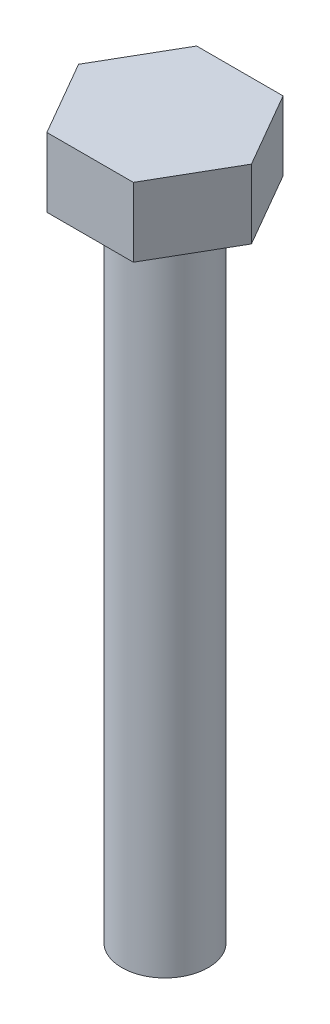
ISO-10303-21;
HEADER;
FILE_DESCRIPTION(('STEP AP214'),'2;1');
FILE_NAME('part.step','',(''),(''),'','','');
FILE_SCHEMA(('AUTOMOTIVE_DESIGN { 1 0 10303 214 1 1 1 1 }'));
ENDSEC;
DATA;
#1=APPLICATION_CONTEXT('core data for automotive mechanical design processes');
#2=APPLICATION_PROTOCOL_DEFINITION('international standard','automotive_design',2000,#1);
#3=PRODUCT_CONTEXT('',#1,'mechanical');
#4=PRODUCT('Part','Part','',(#3));
#5=PRODUCT_RELATED_PRODUCT_CATEGORY('part','',(#4));
#6=PRODUCT_DEFINITION_FORMATION('','',#4);
#7=PRODUCT_DEFINITION_CONTEXT('part definition',#1,'design');
#8=PRODUCT_DEFINITION('design','',#6,#7);
#9=PRODUCT_DEFINITION_SHAPE('','',#8);
#10=(LENGTH_UNIT() NAMED_UNIT(*) SI_UNIT(.MILLI.,.METRE.));
#11=(NAMED_UNIT(*) PLANE_ANGLE_UNIT() SI_UNIT($,.RADIAN.));
#12=(NAMED_UNIT(*) SI_UNIT($,.STERADIAN.) SOLID_ANGLE_UNIT());
#13=UNCERTAINTY_MEASURE_WITH_UNIT(LENGTH_MEASURE(1.E-05),#10,'distance_accuracy_value','');
#14=(GEOMETRIC_REPRESENTATION_CONTEXT(3) GLOBAL_UNCERTAINTY_ASSIGNED_CONTEXT((#13)) GLOBAL_UNIT_ASSIGNED_CONTEXT((#10,
#11,#12)) REPRESENTATION_CONTEXT('',''));
#15=CARTESIAN_POINT('',(0.,0.,0.));
#16=DIRECTION('',(0.,0.,1.));
#17=DIRECTION('',(1.,0.,0.));
#18=AXIS2_PLACEMENT_3D('',#15,#16,#17);
#19=CARTESIAN_POINT('',(0.,75.,0.));
#20=DIRECTION('',(0.,-1.,0.));
#21=DIRECTION('',(0.,0.,-1.));
#22=AXIS2_PLACEMENT_3D('',#19,#20,#21);
#23=CYLINDRICAL_SURFACE('',#22,5.);
#24=CARTESIAN_POINT('',(0.,75.,0.));
#25=DIRECTION('',(0.,1.,0.));
#26=DIRECTION('',(0.,0.,1.));
#27=AXIS2_PLACEMENT_3D('',#24,#25,#26);
#28=CIRCLE('',#27,5.);
#29=CARTESIAN_POINT('',(0.,75.,5.));
#30=VERTEX_POINT('',#29);
#31=EDGE_CURVE('E11',#30,#30,#28,.T.);
#32=ORIENTED_EDGE('',*,*,#31,.F.);
#33=EDGE_LOOP('',(#32));
#34=FACE_BOUND('',#33,.T.);
#35=CARTESIAN_POINT('',(0.,0.,0.));
#36=DIRECTION('',(0.,1.,0.));
#37=DIRECTION('',(0.,0.,1.));
#38=AXIS2_PLACEMENT_3D('',#35,#36,#37);
#39=CIRCLE('',#38,5.);
#40=CARTESIAN_POINT('',(0.,0.,5.));
#41=VERTEX_POINT('',#40);
#42=EDGE_CURVE('E35',#41,#41,#39,.T.);
#43=ORIENTED_EDGE('',*,*,#42,.T.);
#44=EDGE_LOOP('',(#43));
#45=FACE_BOUND('',#44,.T.);
#46=ADVANCED_FACE('F32',(#34,#45),#23,.T.);
#47=CARTESIAN_POINT('',(0.,0.,0.));
#48=DIRECTION('',(0.,1.,0.));
#49=DIRECTION('',(0.,0.,1.));
#50=AXIS2_PLACEMENT_3D('',#47,#48,#49);
#51=PLANE('',#50);
#52=ORIENTED_EDGE('',*,*,#42,.F.);
#53=EDGE_LOOP('',(#52));
#54=FACE_BOUND('',#53,.T.);
#55=ADVANCED_FACE('F140',(#54),#51,.F.);
#56=CARTESIAN_POINT('',(-9.99999999999998,83.,0.));
#57=DIRECTION('',(0.86602540378444,0.,0.499999999999998));
#58=DIRECTION('',(0.499999999999998,0.,-0.86602540378444));
#59=AXIS2_PLACEMENT_3D('',#56,#57,#58);
#60=PLANE('',#59);
#61=DIRECTION('',(-0.499999999999998,0.,0.86602540378444));
#62=VECTOR('',#61,1.);
#63=CARTESIAN_POINT('',(-9.99999999999998,75.,0.));
#64=LINE('',#63,#62);
#65=CARTESIAN_POINT('',(-5.,75.,-8.66025403784436));
#66=VERTEX_POINT('',#65);
#67=CARTESIAN_POINT('',(-9.99999999999998,75.,0.));
#68=VERTEX_POINT('',#67);
#69=EDGE_CURVE('E117',#66,#68,#64,.T.);
#70=ORIENTED_EDGE('',*,*,#69,.T.);
#71=DIRECTION('',(0.,-1.,0.));
#72=VECTOR('',#71,1.);
#73=CARTESIAN_POINT('',(-9.99999999999998,83.,0.));
#74=LINE('',#73,#72);
#75=CARTESIAN_POINT('',(-9.99999999999998,83.,0.));
#76=VERTEX_POINT('',#75);
#77=EDGE_CURVE('E134',#76,#68,#74,.T.);
#78=ORIENTED_EDGE('',*,*,#77,.F.);
#79=DIRECTION('',(-0.499999999999998,0.,0.86602540378444));
#80=VECTOR('',#79,1.);
#81=CARTESIAN_POINT('',(-9.99999999999998,83.,0.));
#82=LINE('',#81,#80);
#83=CARTESIAN_POINT('',(-5.,83.,-8.66025403784436));
#84=VERTEX_POINT('',#83);
#85=EDGE_CURVE('E127',#84,#76,#82,.T.);
#86=ORIENTED_EDGE('',*,*,#85,.F.);
#87=DIRECTION('',(0.,-1.,0.));
#88=VECTOR('',#87,1.);
#89=CARTESIAN_POINT('',(-5.,83.,-8.66025403784436));
#90=LINE('',#89,#88);
#91=EDGE_CURVE('E113',#84,#66,#90,.T.);
#92=ORIENTED_EDGE('',*,*,#91,.T.);
#93=EDGE_LOOP('',(#70,#78,#86,#92));
#94=FACE_BOUND('',#93,.T.);
#95=ADVANCED_FACE('F142',(#94),#60,.F.);
#96=CARTESIAN_POINT('',(-4.99999999999996,83.,8.66025403784441));
#97=DIRECTION('',(0.866025403784437,0.,-0.500000000000002));
#98=DIRECTION('',(-0.500000000000002,0.,-0.866025403784437));
#99=AXIS2_PLACEMENT_3D('',#96,#97,#98);
#100=PLANE('',#99);
#101=DIRECTION('',(0.500000000000002,0.,0.866025403784437));
#102=VECTOR('',#101,1.);
#103=CARTESIAN_POINT('',(-4.99999999999996,75.,8.66025403784441));
#104=LINE('',#103,#102);
#105=CARTESIAN_POINT('',(-4.99999999999996,75.,8.66025403784441));
#106=VERTEX_POINT('',#105);
#107=EDGE_CURVE('E120',#68,#106,#104,.T.);
#108=ORIENTED_EDGE('',*,*,#107,.T.);
#109=DIRECTION('',(0.,-1.,0.));
#110=VECTOR('',#109,1.);
#111=CARTESIAN_POINT('',(-4.99999999999996,83.,8.66025403784441));
#112=LINE('',#111,#110);
#113=CARTESIAN_POINT('',(-4.99999999999996,83.,8.66025403784441));
#114=VERTEX_POINT('',#113);
#115=EDGE_CURVE('E131',#114,#106,#112,.T.);
#116=ORIENTED_EDGE('',*,*,#115,.F.);
#117=DIRECTION('',(0.500000000000002,0.,0.866025403784437));
#118=VECTOR('',#117,1.);
#119=CARTESIAN_POINT('',(-4.99999999999996,83.,8.66025403784441));
#120=LINE('',#119,#118);
#121=EDGE_CURVE('E86',#76,#114,#120,.T.);
#122=ORIENTED_EDGE('',*,*,#121,.F.);
#123=ORIENTED_EDGE('',*,*,#77,.T.);
#124=EDGE_LOOP('',(#108,#116,#122,#123));
#125=FACE_BOUND('',#124,.T.);
#126=ADVANCED_FACE('F147',(#125),#100,.F.);
#127=CARTESIAN_POINT('',(5.00000000000004,83.,8.66025403784443));
#128=DIRECTION('',(0.,0.,-1.));
#129=DIRECTION('',(-1.,0.,0.));
#130=AXIS2_PLACEMENT_3D('',#127,#128,#129);
#131=PLANE('',#130);
#132=DIRECTION('',(1.,0.,0.));
#133=VECTOR('',#132,1.);
#134=CARTESIAN_POINT('',(5.00000000000004,75.,8.66025403784443));
#135=LINE('',#134,#133);
#136=CARTESIAN_POINT('',(5.00000000000004,75.,8.66025403784443));
#137=VERTEX_POINT('',#136);
#138=EDGE_CURVE('E122',#106,#137,#135,.T.);
#139=ORIENTED_EDGE('',*,*,#138,.T.);
#140=DIRECTION('',(0.,-1.,0.));
#141=VECTOR('',#140,1.);
#142=CARTESIAN_POINT('',(5.00000000000004,83.,8.66025403784443));
#143=LINE('',#142,#141);
#144=CARTESIAN_POINT('',(5.00000000000004,83.,8.66025403784443));
#145=VERTEX_POINT('',#144);
#146=EDGE_CURVE('E108',#145,#137,#143,.T.);
#147=ORIENTED_EDGE('',*,*,#146,.F.);
#148=DIRECTION('',(1.,0.,0.));
#149=VECTOR('',#148,1.);
#150=CARTESIAN_POINT('',(5.00000000000004,83.,8.66025403784443));
#151=LINE('',#150,#149);
#152=EDGE_CURVE('E99',#114,#145,#151,.T.);
#153=ORIENTED_EDGE('',*,*,#152,.F.);
#154=ORIENTED_EDGE('',*,*,#115,.T.);
#155=EDGE_LOOP('',(#139,#147,#153,#154));
#156=FACE_BOUND('',#155,.T.);
#157=ADVANCED_FACE('F154',(#156),#131,.F.);
#158=CARTESIAN_POINT('',(10.,83.,0.));
#159=DIRECTION('',(-0.866025403784439,0.,-0.5));
#160=DIRECTION('',(-0.5,0.,0.866025403784439));
#161=AXIS2_PLACEMENT_3D('',#158,#159,#160);
#162=PLANE('',#161);
#163=DIRECTION('',(0.5,0.,-0.866025403784439));
#164=VECTOR('',#163,1.);
#165=CARTESIAN_POINT('',(10.,75.,0.));
#166=LINE('',#165,#164);
#167=CARTESIAN_POINT('',(10.,75.,0.));
#168=VERTEX_POINT('',#167);
#169=EDGE_CURVE('E107',#137,#168,#166,.T.);
#170=ORIENTED_EDGE('',*,*,#169,.T.);
#171=DIRECTION('',(0.,-1.,0.));
#172=VECTOR('',#171,1.);
#173=CARTESIAN_POINT('',(10.,83.,0.));
#174=LINE('',#173,#172);
#175=CARTESIAN_POINT('',(10.,83.,0.));
#176=VERTEX_POINT('',#175);
#177=EDGE_CURVE('E104',#176,#168,#174,.T.);
#178=ORIENTED_EDGE('',*,*,#177,.F.);
#179=DIRECTION('',(0.5,0.,-0.866025403784439));
#180=VECTOR('',#179,1.);
#181=CARTESIAN_POINT('',(10.,83.,0.));
#182=LINE('',#181,#180);
#183=EDGE_CURVE('E93',#145,#176,#182,.T.);
#184=ORIENTED_EDGE('',*,*,#183,.F.);
#185=ORIENTED_EDGE('',*,*,#146,.T.);
#186=EDGE_LOOP('',(#170,#178,#184,#185));
#187=FACE_BOUND('',#186,.T.);
#188=ADVANCED_FACE('F105',(#187),#162,.F.);
#189=CARTESIAN_POINT('',(5.,83.,-8.66025403784436));
#190=DIRECTION('',(-0.866025403784437,0.,0.500000000000003));
#191=DIRECTION('',(0.500000000000002,0.,0.866025403784437));
#192=AXIS2_PLACEMENT_3D('',#189,#190,#191);
#193=PLANE('',#192);
#194=DIRECTION('',(-0.500000000000002,0.,-0.866025403784437));
#195=VECTOR('',#194,1.);
#196=CARTESIAN_POINT('',(5.,75.,-8.66025403784436));
#197=LINE('',#196,#195);
#198=CARTESIAN_POINT('',(5.,75.,-8.66025403784436));
#199=VERTEX_POINT('',#198);
#200=EDGE_CURVE('E71',#168,#199,#197,.T.);
#201=ORIENTED_EDGE('',*,*,#200,.T.);
#202=DIRECTION('',(0.,-1.,0.));
#203=VECTOR('',#202,1.);
#204=CARTESIAN_POINT('',(5.,83.,-8.66025403784436));
#205=LINE('',#204,#203);
#206=CARTESIAN_POINT('',(5.,83.,-8.66025403784436));
#207=VERTEX_POINT('',#206);
#208=EDGE_CURVE('E109',#207,#199,#205,.T.);
#209=ORIENTED_EDGE('',*,*,#208,.F.);
#210=DIRECTION('',(-0.500000000000002,0.,-0.866025403784437));
#211=VECTOR('',#210,1.);
#212=CARTESIAN_POINT('',(5.,83.,-8.66025403784436));
#213=LINE('',#212,#211);
#214=EDGE_CURVE('E97',#176,#207,#213,.T.);
#215=ORIENTED_EDGE('',*,*,#214,.F.);
#216=ORIENTED_EDGE('',*,*,#177,.T.);
#217=EDGE_LOOP('',(#201,#209,#215,#216));
#218=FACE_BOUND('',#217,.T.);
#219=ADVANCED_FACE('F111',(#218),#193,.F.);
#220=CARTESIAN_POINT('',(-5.,83.,-8.66025403784436));
#221=DIRECTION('',(0.,0.,1.));
#222=DIRECTION('',(1.,0.,0.));
#223=AXIS2_PLACEMENT_3D('',#220,#221,#222);
#224=PLANE('',#223);
#225=DIRECTION('',(-1.,0.,0.));
#226=VECTOR('',#225,1.);
#227=CARTESIAN_POINT('',(-5.,75.,-8.66025403784436));
#228=LINE('',#227,#226);
#229=EDGE_CURVE('E77',#199,#66,#228,.T.);
#230=ORIENTED_EDGE('',*,*,#229,.T.);
#231=ORIENTED_EDGE('',*,*,#91,.F.);
#232=DIRECTION('',(-1.,0.,0.));
#233=VECTOR('',#232,1.);
#234=CARTESIAN_POINT('',(-5.,83.,-8.66025403784436));
#235=LINE('',#234,#233);
#236=EDGE_CURVE('E48',#207,#84,#235,.T.);
#237=ORIENTED_EDGE('',*,*,#236,.F.);
#238=ORIENTED_EDGE('',*,*,#208,.T.);
#239=EDGE_LOOP('',(#230,#231,#237,#238));
#240=FACE_BOUND('',#239,.T.);
#241=ADVANCED_FACE('F162',(#240),#224,.F.);
#242=CARTESIAN_POINT('',(0.,83.,0.));
#243=DIRECTION('',(0.,-1.,0.));
#244=DIRECTION('',(0.,0.,-1.));
#245=AXIS2_PLACEMENT_3D('',#242,#243,#244);
#246=PLANE('',#245);
#247=ORIENTED_EDGE('',*,*,#85,.T.);
#248=ORIENTED_EDGE('',*,*,#121,.T.);
#249=ORIENTED_EDGE('',*,*,#152,.T.);
#250=ORIENTED_EDGE('',*,*,#183,.T.);
#251=ORIENTED_EDGE('',*,*,#214,.T.);
#252=ORIENTED_EDGE('',*,*,#236,.T.);
#253=EDGE_LOOP('',(#247,#248,#249,#250,#251,#252));
#254=FACE_BOUND('',#253,.T.);
#255=ADVANCED_FACE('F95',(#254),#246,.F.);
#256=CARTESIAN_POINT('',(0.,75.,0.));
#257=DIRECTION('',(0.,-1.,0.));
#258=DIRECTION('',(0.,0.,-1.));
#259=AXIS2_PLACEMENT_3D('',#256,#257,#258);
#260=PLANE('',#259);
#261=ORIENTED_EDGE('',*,*,#31,.T.);
#262=EDGE_LOOP('',(#261));
#263=FACE_BOUND('',#262,.T.);
#264=ORIENTED_EDGE('',*,*,#69,.F.);
#265=ORIENTED_EDGE('',*,*,#229,.F.);
#266=ORIENTED_EDGE('',*,*,#200,.F.);
#267=ORIENTED_EDGE('',*,*,#169,.F.);
#268=ORIENTED_EDGE('',*,*,#138,.F.);
#269=ORIENTED_EDGE('',*,*,#107,.F.);
#270=EDGE_LOOP('',(#264,#265,#266,#267,#268,#269));
#271=FACE_BOUND('',#270,.T.);
#272=ADVANCED_FACE('F165',(#263,#271),#260,.T.);
#273=CLOSED_SHELL('',(#46,#55,#95,#126,#157,#188,#219,#241,#255,#272));
#274=MANIFOLD_SOLID_BREP('B2',#273);
#275=ADVANCED_BREP_SHAPE_REPRESENTATION('',(#18,#274),#14);
#276=SHAPE_DEFINITION_REPRESENTATION(#9,#275);
ENDSEC;
END-ISO-10303-21;
